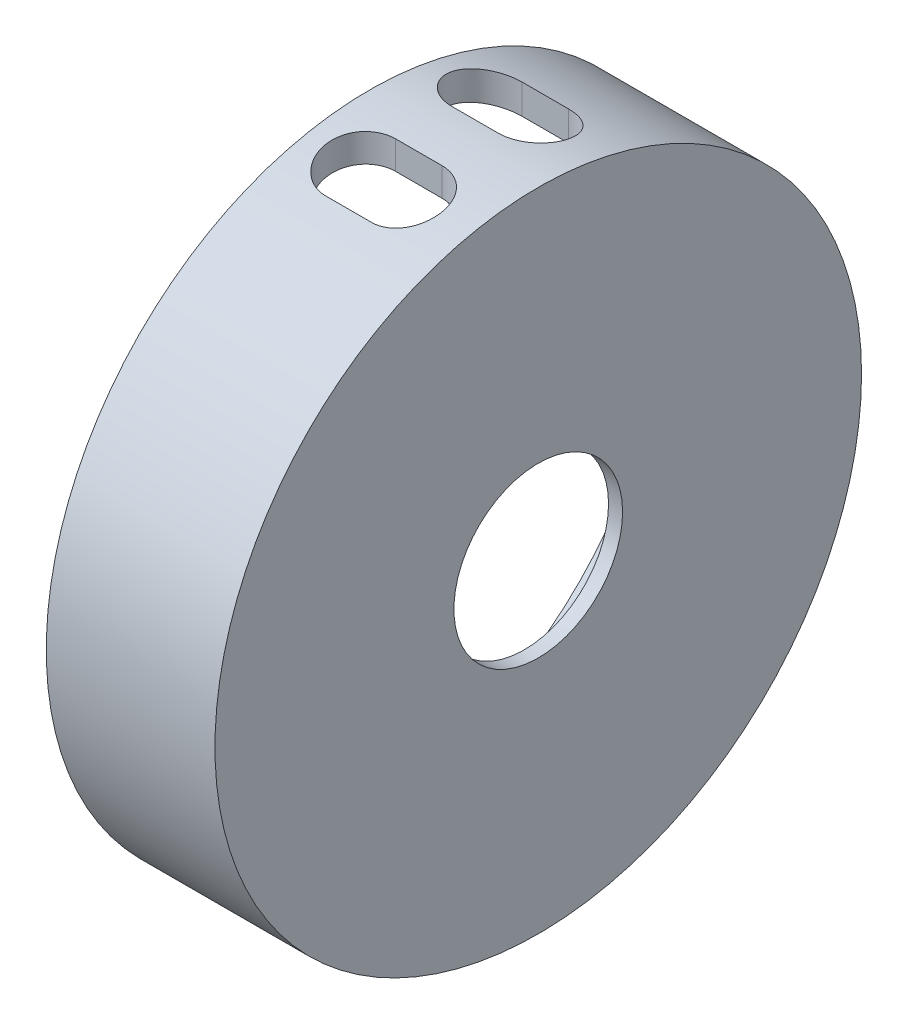
ISO-10303-21;
HEADER;
FILE_DESCRIPTION(('STEP AP214'),'2;1');
FILE_NAME('part.step','',(''),(''),'','','');
FILE_SCHEMA(('AUTOMOTIVE_DESIGN { 1 0 10303 214 1 1 1 1 }'));
ENDSEC;
DATA;
#1=APPLICATION_CONTEXT('core data for automotive mechanical design processes');
#2=APPLICATION_PROTOCOL_DEFINITION('international standard','automotive_design',2000,#1);
#3=PRODUCT_CONTEXT('',#1,'mechanical');
#4=PRODUCT('Part','Part','',(#3));
#5=PRODUCT_RELATED_PRODUCT_CATEGORY('part','',(#4));
#6=PRODUCT_DEFINITION_FORMATION('','',#4);
#7=PRODUCT_DEFINITION_CONTEXT('part definition',#1,'design');
#8=PRODUCT_DEFINITION('design','',#6,#7);
#9=PRODUCT_DEFINITION_SHAPE('','',#8);
#10=(LENGTH_UNIT() NAMED_UNIT(*) SI_UNIT(.MILLI.,.METRE.));
#11=(NAMED_UNIT(*) PLANE_ANGLE_UNIT() SI_UNIT($,.RADIAN.));
#12=(NAMED_UNIT(*) SI_UNIT($,.STERADIAN.) SOLID_ANGLE_UNIT());
#13=UNCERTAINTY_MEASURE_WITH_UNIT(LENGTH_MEASURE(1.E-05),#10,'distance_accuracy_value','');
#14=(GEOMETRIC_REPRESENTATION_CONTEXT(3) GLOBAL_UNCERTAINTY_ASSIGNED_CONTEXT((#13)) GLOBAL_UNIT_ASSIGNED_CONTEXT((#10,
#11,#12)) REPRESENTATION_CONTEXT('',''));
#15=CARTESIAN_POINT('',(0.,0.,0.));
#16=DIRECTION('',(0.,0.,1.));
#17=DIRECTION('',(1.,0.,0.));
#18=AXIS2_PLACEMENT_3D('',#15,#16,#17);
#19=CARTESIAN_POINT('',(12.,0.,0.));
#20=DIRECTION('',(-1.,0.,0.));
#21=DIRECTION('',(0.,0.,1.));
#22=AXIS2_PLACEMENT_3D('',#19,#20,#21);
#23=CYLINDRICAL_SURFACE('',#22,21.);
#24=CARTESIAN_POINT('',(7.15,20.9045449603669,-2.));
#25=CARTESIAN_POINT('',(7.22021227047538,20.9045426913064,-2.00000122796222));
#26=CARTESIAN_POINT('',(7.29038085489079,20.9042510069695,-2.00307486239214));
#27=CARTESIAN_POINT('',(7.43017121643106,20.9030845233542,-2.01522027917594));
#28=CARTESIAN_POINT('',(7.49979315974062,20.9022099088341,-2.02429016102667));
#29=CARTESIAN_POINT('',(7.70720455335078,20.8987051859865,-2.06027511636815));
#30=CARTESIAN_POINT('',(7.84355255118449,20.8951941995455,-2.09596555316585));
#31=CARTESIAN_POINT('',(8.10822270286466,20.8856411869064,-2.18910089355342));
#32=CARTESIAN_POINT('',(8.2365533780406,20.8796019024159,-2.24652222552062));
#33=CARTESIAN_POINT('',(8.48192598056066,20.8646267124957,-2.38158509549755));
#34=CARTESIAN_POINT('',(8.59897621702843,20.855692960607,-2.45921159204727));
#35=CARTESIAN_POINT('',(8.7639750741713,20.839726857974,-2.58993053218514));
#36=CARTESIAN_POINT('',(8.81753625925611,20.8339292894598,-2.63624494562));
#37=CARTESIAN_POINT('',(8.92033542067504,20.8214112085745,-2.73335541180013));
#38=CARTESIAN_POINT('',(8.96957373069827,20.8146907675442,-2.78415111801985));
#39=CARTESIAN_POINT('',(9.06331224841329,20.8002810531418,-2.88983516679451));
#40=CARTESIAN_POINT('',(9.10781103449678,20.7925914905857,-2.94472472894426));
#41=CARTESIAN_POINT('',(9.1918954958655,20.7762353688714,-3.05799411598975));
#42=CARTESIAN_POINT('',(9.23148067206817,20.7675687106386,-3.11637429454165));
#43=CARTESIAN_POINT('',(9.33995981844007,20.7407400300271,-3.29169959086135));
#44=CARTESIAN_POINT('',(9.4020019828851,20.7212239671093,-3.41276170498135));
#45=CARTESIAN_POINT('',(9.50620369317589,20.6785336460831,-3.66255239164538));
#46=CARTESIAN_POINT('',(9.54836069927927,20.6553589211928,-3.79128194111461));
#47=CARTESIAN_POINT('',(9.59691202057761,20.6172374754006,-3.99181501825951));
#48=CARTESIAN_POINT('',(9.61081239198555,20.603506654933,-4.06210855893026));
#49=CARTESIAN_POINT('',(9.63249958772457,20.5751304089876,-4.20347366862683));
#50=CARTESIAN_POINT('',(9.64028692795072,20.560485060802,-4.27454517148494));
#51=CARTESIAN_POINT('',(9.64724253449908,20.5379052238474,-4.38129849978757));
#52=CARTESIAN_POINT('',(9.6487735150127,20.5302767597358,-4.41690676063194));
#53=CARTESIAN_POINT('',(9.6502244194628,20.5148276540308,-4.48811450060974));
#54=CARTESIAN_POINT('',(9.65014441715129,20.5070070212513,-4.52371398007057));
#55=CARTESIAN_POINT('',(9.6475802596661,20.4832808437769,-4.63039064036622));
#56=CARTESIAN_POINT('',(9.64277256636663,20.4671089584302,-4.70135578864877));
#57=CARTESIAN_POINT('',(9.61958297101692,20.4183791418986,-4.91017941075926));
#58=CARTESIAN_POINT('',(9.59260791689488,20.3849700008098,-5.04697044168433));
#59=CARTESIAN_POINT('',(9.51668199817833,20.3169935559341,-5.31402192021364));
#60=CARTESIAN_POINT('',(9.4677145020562,20.2824253939927,-5.44427734230821));
#61=CARTESIAN_POINT('',(9.34633294080805,20.2118195065521,-5.70095325877762));
#62=CARTESIAN_POINT('',(9.27293154971143,20.1757884639414,-5.82691129778255));
#63=CARTESIAN_POINT('',(9.10510529061933,20.1056566325899,-6.06447974463556));
#64=CARTESIAN_POINT('',(9.01069402916139,20.0715546124107,-6.17609936495591));
#65=CARTESIAN_POINT('',(8.80400582825571,20.0076273414253,-6.38014108334063));
#66=CARTESIAN_POINT('',(8.69194486628871,19.9777577605186,-6.47276755956841));
#67=CARTESIAN_POINT('',(8.45252424558646,19.9235314263197,-6.63780532082079));
#68=CARTESIAN_POINT('',(8.32515385937471,19.8991785735337,-6.71020231133324));
#69=CARTESIAN_POINT('',(8.0638781601761,19.8583914268227,-6.82994654514799));
#70=CARTESIAN_POINT('',(7.93041074789508,19.8416892873839,-6.87814792226523));
#71=CARTESIAN_POINT('',(7.72533238106218,19.8225064613745,-6.93315169590463));
#72=CARTESIAN_POINT('',(7.65620340125308,19.8170920893588,-6.94859910754532));
#73=CARTESIAN_POINT('',(7.51676858314176,19.8083164597545,-6.97357734977822));
#74=CARTESIAN_POINT('',(7.44646350484752,19.8049539251865,-6.98311186037766));
#75=CARTESIAN_POINT('',(7.33831295859856,19.801439535912,-6.99306826525512));
#76=CARTESIAN_POINT('',(7.30067776270716,19.8005215533748,-6.99566659345754));
#77=CARTESIAN_POINT('',(7.22536380016249,19.7992969693932,-6.99913147466311));
#78=CARTESIAN_POINT('',(7.18768514225142,19.7989896253679,-7.0000001310757));
#79=CARTESIAN_POINT('',(7.15,19.7989898732233,-7.));
#80=B_SPLINE_CURVE_WITH_KNOTS('',3,(#24,#25,#26,#27,#28,#29,#30,#31,#32,#33,#34,#35,#36,#37,#38,
#39,#40,#41,#42,#43,#44,#45,#46,#47,#48,#49,#50,#51,#52,#53,#54,#55,#56,#57,#58,#59,#60,#61,#62,
#63,#64,#65,#66,#67,#68,#69,#70,#71,#72,#73,#74,#75,#76,#77,#78,#79),.UNSPECIFIED.,.F.,.F.,(4,2,
2,2,2,2,2,2,2,2,2,2,2,2,2,2,2,2,2,2,2,2,2,2,2,2,2,4),(0.,0.210487846141967,0.420909010386728,
0.841712893386399,1.26206163030663,1.6820983348783,1.89500626433395,2.10789774463564,
2.32085290243095,2.53382967272482,2.94425700987647,3.35473675282892,3.57339324619602,
3.79203128457202,3.90134707106748,4.01065785301557,4.22924958644451,4.65732176679469,
5.08571821825449,5.53410180809868,5.98219585382649,6.4251807530192,6.86847788612383,
7.29477566797926,7.50766678501958,7.72042527187464,7.83359447713268,7.94662597597191),.UNSPECIFIED.);
#81=CARTESIAN_POINT('',(7.15,20.9045449603669,-2.));
#82=VERTEX_POINT('',#81);
#83=CARTESIAN_POINT('',(7.15,19.7989898732233,-7.));
#84=VERTEX_POINT('',#83);
#85=EDGE_CURVE('E262',#82,#84,#80,.T.);
#86=ORIENTED_EDGE('',*,*,#85,.T.);
#87=DIRECTION('',(-1.,0.,0.));
#88=VECTOR('',#87,1.);
#89=CARTESIAN_POINT('',(12.,19.7989898732233,-7.));
#90=LINE('',#89,#88);
#91=CARTESIAN_POINT('',(3.85,19.7989898732233,-7.));
#92=VERTEX_POINT('',#91);
#93=EDGE_CURVE('E267',#84,#92,#90,.T.);
#94=ORIENTED_EDGE('',*,*,#93,.T.);
#95=CARTESIAN_POINT('',(3.85,19.7989898732233,-7.));
#96=CARTESIAN_POINT('',(3.78214047565855,19.7989870328711,-7.00000170529082));
#97=CARTESIAN_POINT('',(3.71432479908817,19.8000062933489,-6.99712574690852));
#98=CARTESIAN_POINT('',(3.57925465617807,19.8040158000695,-6.98577216492585));
#99=CARTESIAN_POINT('',(3.51199992870563,19.8070050706234,-6.97729731428958));
#100=CARTESIAN_POINT('',(3.31199783380946,19.8188013426174,-6.9437526491557));
#101=CARTESIAN_POINT('',(3.18069147168994,19.8304374906481,-6.91056124866765));
#102=CARTESIAN_POINT('',(2.92597989701261,19.860272737179,-6.8243403419459));
#103=CARTESIAN_POINT('',(2.80256032831641,19.8784594864682,-6.7713481572204));
#104=CARTESIAN_POINT('',(2.56615187324871,19.9203229117032,-6.64718080911228));
#105=CARTESIAN_POINT('',(2.45316391727838,19.944000076682,-6.57600402596425));
#106=CARTESIAN_POINT('',(2.29128021536958,19.9833411572921,-6.45507438395982));
#107=CARTESIAN_POINT('',(2.23747334556887,19.9974559024028,-6.41124686004126));
#108=CARTESIAN_POINT('',(2.13395108805763,20.0267058570919,-6.31928633593751));
#109=CARTESIAN_POINT('',(2.08423551577239,20.0418410205791,-6.27115353018539));
#110=CARTESIAN_POINT('',(1.98925123792332,20.0729320332687,-6.17091152494372));
#111=CARTESIAN_POINT('',(1.94398360141627,20.088888078372,-6.11880137482489));
#112=CARTESIAN_POINT('',(1.85804910720295,20.1213778706893,-6.01110020385699));
#113=CARTESIAN_POINT('',(1.81738272338226,20.1379116771781,-5.95550882538851));
#114=CARTESIAN_POINT('',(1.70196549891276,20.1883036424732,-5.78331325176012));
#115=CARTESIAN_POINT('',(1.63441917750148,20.2227443911079,-5.66195081633704));
#116=CARTESIAN_POINT('',(1.51976253901894,20.2916288919584,-5.40988541223444));
#117=CARTESIAN_POINT('',(1.47266005756407,20.3260726402739,-5.27917888451167));
#118=CARTESIAN_POINT('',(1.41720880231956,20.3778957271072,-5.07413171853143));
#119=CARTESIAN_POINT('',(1.40103264522759,20.3957379342721,-5.00194953744232));
#120=CARTESIAN_POINT('',(1.37512314055757,20.4309076680292,-4.85629619214898));
#121=CARTESIAN_POINT('',(1.36538958317891,20.4482352113637,-4.78282506999857));
#122=CARTESIAN_POINT('',(1.35263941960021,20.4822064550656,-4.6351866623409));
#123=CARTESIAN_POINT('',(1.34961904087906,20.4988505343462,-4.56101979136054));
#124=CARTESIAN_POINT('',(1.35046876450944,20.5313222831867,-4.41254798090227));
#125=CARTESIAN_POINT('',(1.35433871277357,20.5471499709952,-4.33824304454902));
#126=CARTESIAN_POINT('',(1.36845414032245,20.5771448671151,-4.19360242181085));
#127=CARTESIAN_POINT('',(1.37838940193202,20.5913552049029,-4.12324523016888));
#128=CARTESIAN_POINT('',(1.40422413124444,20.6188519845908,-3.9834694804391));
#129=CARTESIAN_POINT('',(1.42012361971402,20.6321384232737,-3.91405092562037));
#130=CARTESIAN_POINT('',(1.4765934933131,20.6705418099981,-3.70785229363806));
#131=CARTESIAN_POINT('',(1.52593823420601,20.6942089282728,-3.57309967725121));
#132=CARTESIAN_POINT('',(1.64695785163578,20.7374300298891,-3.3130671323615));
#133=CARTESIAN_POINT('',(1.71866033274868,20.7569788782283,-3.18779915324835));
#134=CARTESIAN_POINT('',(1.84169650890908,20.7831932897331,-3.01039510418385));
#135=CARTESIAN_POINT('',(1.88528960608179,20.7914133651215,-2.95300943522962));
#136=CARTESIAN_POINT('',(1.97742953614456,20.8068472135393,-2.84222281491));
#137=CARTESIAN_POINT('',(2.02597597166261,20.8140610671812,-2.78882154449802));
#138=CARTESIAN_POINT('',(2.17522707730034,20.8338066399709,-2.63864957471962));
#139=CARTESIAN_POINT('',(2.28232054280616,20.8450170212074,-2.54792340438902));
#140=CARTESIAN_POINT('',(2.5103697551143,20.8642314739099,-2.3854922522048));
#141=CARTESIAN_POINT('',(2.63133821782961,20.8722325735054,-2.31380492142163));
#142=CARTESIAN_POINT('',(2.88305124951773,20.8854139830587,-2.19163113753236));
#143=CARTESIAN_POINT('',(3.01375316998462,20.8906058600345,-2.14105794634194));
#144=CARTESIAN_POINT('',(3.2816480201246,20.8985314347218,-2.062274548604));
#145=CARTESIAN_POINT('',(3.41882864741505,20.9012696086593,-2.03402363130397));
#146=CARTESIAN_POINT('',(3.60585821141722,20.9034264712895,-2.01166085121076));
#147=CARTESIAN_POINT('',(3.65461879728873,20.9038462204572,-2.00729166676714));
#148=CARTESIAN_POINT('',(3.75224577557783,20.9044050582509,-2.00146437606446));
#149=CARTESIAN_POINT('',(3.80111192036139,20.9045445435014,-2.00000215595313));
#150=CARTESIAN_POINT('',(3.85,20.9045449603669,-2.));
#151=B_SPLINE_CURVE_WITH_KNOTS('',3,(#95,#96,#97,#98,#99,#100,#101,#102,#103,#104,#105,#106,
#107,#108,#109,#110,#111,#112,#113,#114,#115,#116,#117,#118,#119,#120,#121,#122,#123,#124,#125,
#126,#127,#128,#129,#130,#131,#132,#133,#134,#135,#136,#137,#138,#139,#140,#141,#142,#143,#144,
#145,#146,#147,#148,#149,#150),.UNSPECIFIED.,.F.,.F.,(4,2,2,2,2,2,2,2,2,2,2,2,2,2,2,2,2,2,2,2,2,
2,2,2,2,2,2,4),(0.,0.203429308453589,0.406757939902441,0.812464943220929,1.21741107577254,
1.62239329086719,1.83463743201691,2.0468719927346,2.25915743967099,2.47146473014126,
2.89884586132989,3.32639065275778,3.55443042723125,3.78246277531712,4.0103669464797,
4.23826602111762,4.4553855756266,4.67250588612687,5.10665664150565,5.54134556944593,
5.75869536295974,5.9760277336941,6.39621994633178,6.81680037348916,7.23563561481905,
7.6537052213401,7.80051217606334,7.9471112254984),.UNSPECIFIED.);
#152=CARTESIAN_POINT('',(3.85,20.9045449603669,-2.));
#153=VERTEX_POINT('',#152);
#154=EDGE_CURVE('E255',#92,#153,#151,.T.);
#155=ORIENTED_EDGE('',*,*,#154,.T.);
#156=DIRECTION('',(-1.,0.,0.));
#157=VECTOR('',#156,1.);
#158=CARTESIAN_POINT('',(12.,20.9045449603669,-2.));
#159=LINE('',#158,#157);
#160=EDGE_CURVE('E131',#82,#153,#159,.T.);
#161=ORIENTED_EDGE('',*,*,#160,.F.);
#162=EDGE_LOOP('',(#86,#94,#155,#161));
#163=FACE_BOUND('',#162,.T.);
#164=CARTESIAN_POINT('',(0.,0.,0.));
#165=DIRECTION('',(1.,0.,0.));
#166=DIRECTION('',(0.,0.,-1.));
#167=AXIS2_PLACEMENT_3D('',#164,#165,#166);
#168=CIRCLE('',#167,21.);
#169=CARTESIAN_POINT('',(0.,0.,-21.));
#170=VERTEX_POINT('',#169);
#171=EDGE_CURVE('E123',#170,#170,#168,.T.);
#172=ORIENTED_EDGE('',*,*,#171,.F.);
#173=EDGE_LOOP('',(#172));
#174=FACE_BOUND('',#173,.T.);
#175=CARTESIAN_POINT('',(7.14999999999999,20.9045449603669,2.));
#176=CARTESIAN_POINT('',(7.22021227047538,20.9045426913064,2.00000122796221));
#177=CARTESIAN_POINT('',(7.29038085489079,20.9042510069695,2.00307486239214));
#178=CARTESIAN_POINT('',(7.43017121643105,20.9030845233543,2.01522027917593));
#179=CARTESIAN_POINT('',(7.49979315974062,20.9022099088341,2.02429016102667));
#180=CARTESIAN_POINT('',(7.70720455335077,20.8987051859865,2.06027511636814));
#181=CARTESIAN_POINT('',(7.84355255118449,20.8951941995455,2.09596555316585));
#182=CARTESIAN_POINT('',(8.10822270286465,20.8856411869063,2.18910089355342));
#183=CARTESIAN_POINT('',(8.23655337804059,20.8796019024159,2.24652222552061));
#184=CARTESIAN_POINT('',(8.48192598056065,20.8646267124957,2.38158509549755));
#185=CARTESIAN_POINT('',(8.59897621702842,20.8556929606071,2.45921159204727));
#186=CARTESIAN_POINT('',(8.7639750741713,20.839726857974,2.58993053218513));
#187=CARTESIAN_POINT('',(8.8175362592561,20.8339292894598,2.63624494562));
#188=CARTESIAN_POINT('',(8.92033542067503,20.8214112085745,2.73335541180012));
#189=CARTESIAN_POINT('',(8.96957373069826,20.8146907675442,2.78415111801984));
#190=CARTESIAN_POINT('',(9.06331224841328,20.8002810531418,2.8898351667945));
#191=CARTESIAN_POINT('',(9.10781103449677,20.7925914905857,2.94472472894425));
#192=CARTESIAN_POINT('',(9.19189549586549,20.7762353688715,3.05799411598974));
#193=CARTESIAN_POINT('',(9.23148067206817,20.7675687106386,3.11637429454164));
#194=CARTESIAN_POINT('',(9.33995981844006,20.7407400300272,3.29169959086135));
#195=CARTESIAN_POINT('',(9.40200198288509,20.7212239671093,3.41276170498134));
#196=CARTESIAN_POINT('',(9.50620369317589,20.6785336460831,3.66255239164537));
#197=CARTESIAN_POINT('',(9.54836069927927,20.6553589211928,3.7912819411146));
#198=CARTESIAN_POINT('',(9.59691202057761,20.6172374754006,3.9918150182595));
#199=CARTESIAN_POINT('',(9.61081239198555,20.603506654933,4.06210855893025));
#200=CARTESIAN_POINT('',(9.63249958772457,20.5751304089876,4.20347366862682));
#201=CARTESIAN_POINT('',(9.64028692795072,20.560485060802,4.27454517148493));
#202=CARTESIAN_POINT('',(9.64724253449908,20.5379052238474,4.38129849978756));
#203=CARTESIAN_POINT('',(9.6487735150127,20.5302767597358,4.41690676063194));
#204=CARTESIAN_POINT('',(9.6502244194628,20.5148276540308,4.48811450060974));
#205=CARTESIAN_POINT('',(9.65014441715129,20.5070070212513,4.52371398007056));
#206=CARTESIAN_POINT('',(9.6475802596661,20.4832808437769,4.63039064036621));
#207=CARTESIAN_POINT('',(9.64277256636663,20.4671089584302,4.70135578864876));
#208=CARTESIAN_POINT('',(9.61958297101691,20.4183791418986,4.91017941075926));
#209=CARTESIAN_POINT('',(9.59260791689488,20.3849700008098,5.04697044168433));
#210=CARTESIAN_POINT('',(9.51668199817833,20.3169935559341,5.31402192021364));
#211=CARTESIAN_POINT('',(9.46771450205619,20.2824253939927,5.44427734230821));
#212=CARTESIAN_POINT('',(9.34633294080805,20.211819506552,5.70095325877762));
#213=CARTESIAN_POINT('',(9.27293154971143,20.1757884639414,5.82691129778255));
#214=CARTESIAN_POINT('',(9.10510529061933,20.1056566325899,6.06447974463555));
#215=CARTESIAN_POINT('',(9.0106940291614,20.0715546124107,6.17609936495591));
#216=CARTESIAN_POINT('',(8.80400582825572,20.0076273414253,6.38014108334061));
#217=CARTESIAN_POINT('',(8.69194486628872,19.9777577605186,6.4727675595684));
#218=CARTESIAN_POINT('',(8.45252424558648,19.9235314263198,6.63780532082078));
#219=CARTESIAN_POINT('',(8.32515385937473,19.8991785735336,6.71020231133322));
#220=CARTESIAN_POINT('',(8.06387816017612,19.8583914268227,6.82994654514798));
#221=CARTESIAN_POINT('',(7.9304107478951,19.8416892873839,6.87814792226522));
#222=CARTESIAN_POINT('',(7.72533238106219,19.8225064613745,6.93315169590463));
#223=CARTESIAN_POINT('',(7.6562034012531,19.8170920893588,6.94859910754531));
#224=CARTESIAN_POINT('',(7.51676858314177,19.8083164597545,6.97357734977821));
#225=CARTESIAN_POINT('',(7.44646350484753,19.8049539251866,6.98311186037766));
#226=CARTESIAN_POINT('',(7.33831295859857,19.801439535912,6.99306826525512));
#227=CARTESIAN_POINT('',(7.30067776270717,19.8005215533749,6.99566659345754));
#228=CARTESIAN_POINT('',(7.22536380016249,19.7992969693932,6.9991314746631));
#229=CARTESIAN_POINT('',(7.18768514225141,19.7989896253679,7.00000013107569));
#230=CARTESIAN_POINT('',(7.14999999999999,19.7989898732233,7.));
#231=B_SPLINE_CURVE_WITH_KNOTS('',3,(#175,#176,#177,#178,#179,#180,#181,#182,#183,#184,#185,
#186,#187,#188,#189,#190,#191,#192,#193,#194,#195,#196,#197,#198,#199,#200,#201,#202,#203,#204,
#205,#206,#207,#208,#209,#210,#211,#212,#213,#214,#215,#216,#217,#218,#219,#220,#221,#222,#223,
#224,#225,#226,#227,#228,#229,#230),.UNSPECIFIED.,.F.,.F.,(4,2,2,2,2,2,2,2,2,2,2,2,2,2,2,2,2,2,
2,2,2,2,2,2,2,2,2,4),(0.,0.210487846141965,0.420909010386724,0.841712893386394,1.26206163030663,
1.68209833487829,1.89500626433395,2.10789774463563,2.32085290243095,2.53382967272481,
2.94425700987646,3.35473675282891,3.57339324619601,3.79203128457202,3.90134707106748,
4.01065785301556,4.22924958644451,4.65732176679469,5.0857182182545,5.53410180809867,
5.98219585382647,6.42518075301918,6.8684778861238,7.29477566797924,7.50766678501956,
7.72042527187464,7.83359447713268,7.94662597597191),.UNSPECIFIED.);
#232=CARTESIAN_POINT('',(7.14999999999999,20.9045449603669,2.));
#233=VERTEX_POINT('',#232);
#234=CARTESIAN_POINT('',(7.14999999999999,19.7989898732233,7.));
#235=VERTEX_POINT('',#234);
#236=EDGE_CURVE('E11',#233,#235,#231,.T.);
#237=ORIENTED_EDGE('',*,*,#236,.F.);
#238=DIRECTION('',(-1.,0.,0.));
#239=VECTOR('',#238,1.);
#240=CARTESIAN_POINT('',(12.,20.9045449603669,2.));
#241=LINE('',#240,#239);
#242=CARTESIAN_POINT('',(3.85,20.9045449603669,2.));
#243=VERTEX_POINT('',#242);
#244=EDGE_CURVE('E245',#233,#243,#241,.T.);
#245=ORIENTED_EDGE('',*,*,#244,.T.);
#246=CARTESIAN_POINT('',(3.85,19.7989898732233,7.));
#247=CARTESIAN_POINT('',(3.78214047565854,19.7989870328711,7.00000170529082));
#248=CARTESIAN_POINT('',(3.71432479908816,19.8000062933489,6.99712574690852));
#249=CARTESIAN_POINT('',(3.57925465617807,19.8040158000695,6.98577216492584));
#250=CARTESIAN_POINT('',(3.51199992870563,19.8070050706234,6.97729731428958));
#251=CARTESIAN_POINT('',(3.31199783380945,19.8188013426174,6.9437526491557));
#252=CARTESIAN_POINT('',(3.18069147168994,19.8304374906481,6.91056124866765));
#253=CARTESIAN_POINT('',(2.9259798970126,19.860272737179,6.82434034194589));
#254=CARTESIAN_POINT('',(2.8025603283164,19.8784594864682,6.7713481572204));
#255=CARTESIAN_POINT('',(2.5661518732487,19.9203229117032,6.64718080911228));
#256=CARTESIAN_POINT('',(2.45316391727837,19.944000076682,6.57600402596425));
#257=CARTESIAN_POINT('',(2.29128021536958,19.9833411572921,6.45507438395982));
#258=CARTESIAN_POINT('',(2.23747334556887,19.9974559024028,6.41124686004125));
#259=CARTESIAN_POINT('',(2.13395108805762,20.0267058570919,6.31928633593751));
#260=CARTESIAN_POINT('',(2.08423551577239,20.041841020579,6.27115353018538));
#261=CARTESIAN_POINT('',(1.98925123792332,20.0729320332687,6.17091152494371));
#262=CARTESIAN_POINT('',(1.94398360141627,20.088888078372,6.11880137482489));
#263=CARTESIAN_POINT('',(1.85804910720294,20.1213778706893,6.01110020385699));
#264=CARTESIAN_POINT('',(1.81738272338225,20.1379116771781,5.95550882538851));
#265=CARTESIAN_POINT('',(1.70196549891276,20.1883036424732,5.78331325176011));
#266=CARTESIAN_POINT('',(1.63441917750148,20.2227443911079,5.66195081633704));
#267=CARTESIAN_POINT('',(1.51976253901893,20.2916288919584,5.40988541223443));
#268=CARTESIAN_POINT('',(1.47266005756407,20.3260726402739,5.27917888451167));
#269=CARTESIAN_POINT('',(1.41720880231956,20.3778957271072,5.07413171853143));
#270=CARTESIAN_POINT('',(1.40103264522758,20.3957379342721,5.00194953744232));
#271=CARTESIAN_POINT('',(1.37512314055757,20.4309076680292,4.85629619214897));
#272=CARTESIAN_POINT('',(1.36538958317891,20.4482352113637,4.78282506999856));
#273=CARTESIAN_POINT('',(1.35263941960021,20.4822064550656,4.6351866623409));
#274=CARTESIAN_POINT('',(1.34961904087905,20.4988505343462,4.56101979136053));
#275=CARTESIAN_POINT('',(1.35046876450943,20.5313222831867,4.41254798090226));
#276=CARTESIAN_POINT('',(1.35433871277357,20.5471499709952,4.33824304454901));
#277=CARTESIAN_POINT('',(1.36845414032244,20.5771448671151,4.19360242181085));
#278=CARTESIAN_POINT('',(1.37838940193201,20.5913552049029,4.12324523016888));
#279=CARTESIAN_POINT('',(1.40422413124444,20.6188519845908,3.98346948043909));
#280=CARTESIAN_POINT('',(1.42012361971402,20.6321384232737,3.91405092562037));
#281=CARTESIAN_POINT('',(1.47659349331309,20.6705418099981,3.70785229363806));
#282=CARTESIAN_POINT('',(1.52593823420601,20.6942089282728,3.57309967725121));
#283=CARTESIAN_POINT('',(1.64695785163578,20.7374300298891,3.3130671323615));
#284=CARTESIAN_POINT('',(1.71866033274867,20.7569788782283,3.18779915324835));
#285=CARTESIAN_POINT('',(1.84169650890908,20.7831932897331,3.01039510418384));
#286=CARTESIAN_POINT('',(1.88528960608178,20.7914133651215,2.95300943522962));
#287=CARTESIAN_POINT('',(1.97742953614456,20.8068472135393,2.84222281491));
#288=CARTESIAN_POINT('',(2.0259759716626,20.8140610671812,2.78882154449802));
#289=CARTESIAN_POINT('',(2.17522707730033,20.8338066399709,2.63864957471962));
#290=CARTESIAN_POINT('',(2.28232054280615,20.8450170212074,2.54792340438901));
#291=CARTESIAN_POINT('',(2.51036975511429,20.8642314739099,2.3854922522048));
#292=CARTESIAN_POINT('',(2.6313382178296,20.8722325735054,2.31380492142163));
#293=CARTESIAN_POINT('',(2.88305124951772,20.8854139830587,2.19163113753236));
#294=CARTESIAN_POINT('',(3.01375316998462,20.8906058600345,2.14105794634194));
#295=CARTESIAN_POINT('',(3.28164802012459,20.8985314347218,2.062274548604));
#296=CARTESIAN_POINT('',(3.41882864741505,20.9012696086593,2.03402363130396));
#297=CARTESIAN_POINT('',(3.60585821141721,20.9034264712895,2.01166085121076));
#298=CARTESIAN_POINT('',(3.65461879728872,20.9038462204572,2.00729166676714));
#299=CARTESIAN_POINT('',(3.75224577557783,20.9044050582509,2.00146437606445));
#300=CARTESIAN_POINT('',(3.80111192036138,20.9045445435014,2.00000215595312));
#301=CARTESIAN_POINT('',(3.85,20.9045449603669,2.));
#302=B_SPLINE_CURVE_WITH_KNOTS('',3,(#246,#247,#248,#249,#250,#251,#252,#253,#254,#255,#256,
#257,#258,#259,#260,#261,#262,#263,#264,#265,#266,#267,#268,#269,#270,#271,#272,#273,#274,#275,
#276,#277,#278,#279,#280,#281,#282,#283,#284,#285,#286,#287,#288,#289,#290,#291,#292,#293,#294,
#295,#296,#297,#298,#299,#300,#301),.UNSPECIFIED.,.F.,.F.,(4,2,2,2,2,2,2,2,2,2,2,2,2,2,2,2,2,2,
2,2,2,2,2,2,2,2,2,4),(0.,0.203429308453589,0.406757939902441,0.812464943220931,1.21741107577254,
1.6223932908672,1.83463743201691,2.04687199273461,2.25915743967099,2.47146473014126,
2.89884586132989,3.32639065275778,3.55443042723125,3.78246277531712,4.0103669464797,
4.23826602111762,4.4553855756266,4.67250588612687,5.10665664150565,5.54134556944592,
5.75869536295973,5.9760277336941,6.39621994633178,6.81680037348915,7.23563561481905,
7.6537052213401,7.80051217606334,7.9471112254984),.UNSPECIFIED.);
#303=CARTESIAN_POINT('',(3.85,19.7989898732233,7.));
#304=VERTEX_POINT('',#303);
#305=EDGE_CURVE('E237',#304,#243,#302,.T.);
#306=ORIENTED_EDGE('',*,*,#305,.F.);
#307=DIRECTION('',(-1.,0.,0.));
#308=VECTOR('',#307,1.);
#309=CARTESIAN_POINT('',(12.,19.7989898732233,7.));
#310=LINE('',#309,#308);
#311=EDGE_CURVE('E50',#235,#304,#310,.T.);
#312=ORIENTED_EDGE('',*,*,#311,.F.);
#313=EDGE_LOOP('',(#237,#245,#306,#312));
#314=FACE_BOUND('',#313,.T.);
#315=CARTESIAN_POINT('',(11.,0.,0.));
#316=DIRECTION('',(1.,0.,0.));
#317=DIRECTION('',(0.,0.,-1.));
#318=AXIS2_PLACEMENT_3D('',#315,#316,#317);
#319=CIRCLE('',#318,21.);
#320=CARTESIAN_POINT('',(11.,0.,-21.));
#321=VERTEX_POINT('',#320);
#322=EDGE_CURVE('E308',#321,#321,#319,.T.);
#323=ORIENTED_EDGE('',*,*,#322,.T.);
#324=EDGE_LOOP('',(#323));
#325=FACE_BOUND('',#324,.T.);
#326=ADVANCED_FACE('F35',(#163,#174,#314,#325),#23,.F.);
#327=CARTESIAN_POINT('',(12.,0.,0.));
#328=DIRECTION('',(-1.,0.,0.));
#329=DIRECTION('',(0.,0.,1.));
#330=AXIS2_PLACEMENT_3D('',#327,#328,#329);
#331=CYLINDRICAL_SURFACE('',#330,23.);
#332=DIRECTION('',(-1.,0.,0.));
#333=VECTOR('',#332,1.);
#334=CARTESIAN_POINT('',(12.,22.9128784747792,2.));
#335=LINE('',#334,#333);
#336=CARTESIAN_POINT('',(7.14999999999999,22.9128784747792,2.));
#337=VERTEX_POINT('',#336);
#338=CARTESIAN_POINT('',(3.85,22.9128784747792,2.));
#339=VERTEX_POINT('',#338);
#340=EDGE_CURVE('E287',#337,#339,#335,.T.);
#341=ORIENTED_EDGE('',*,*,#340,.F.);
#342=CARTESIAN_POINT('',(7.14999999999999,21.9089023002067,7.));
#343=CARTESIAN_POINT('',(7.81817940564996,21.9089023002067,7.));
#344=CARTESIAN_POINT('',(8.46080969429279,21.9995275773584,6.72703851142851));
#345=CARTESIAN_POINT('',(9.38360030604603,22.2620065551344,5.7995969601645));
#346=CARTESIAN_POINT('',(9.64530595549221,22.4222364473854,5.16518431923384));
#347=CARTESIAN_POINT('',(9.65456613937339,22.6815879602008,3.87057927935779));
#348=CARTESIAN_POINT('',(9.39217372553098,22.7792144380044,3.21395829647147));
#349=CARTESIAN_POINT('',(8.4707088270148,22.8917569663467,2.27806965164943));
#350=CARTESIAN_POINT('',(7.81784585396946,22.9128784747792,2.));
#351=CARTESIAN_POINT('',(7.14999999999999,22.9128784747792,2.));
#352=B_SPLINE_CURVE_WITH_KNOTS('',3,(#342,#343,#344,#345,#346,#347,#348,#349,#350,#351),
.UNSPECIFIED.,.F.,.F.,(4,2,2,2,4),(0.,0.25,0.5,0.75,1.),.UNSPECIFIED.);
#353=CARTESIAN_POINT('',(7.14999999999999,21.9089023002066,7.));
#354=VERTEX_POINT('',#353);
#355=EDGE_CURVE('E187',#337,#354,#352,.F.);
#356=ORIENTED_EDGE('',*,*,#355,.T.);
#357=DIRECTION('',(-1.,0.,0.));
#358=VECTOR('',#357,1.);
#359=CARTESIAN_POINT('',(12.,21.9089023002066,7.));
#360=LINE('',#359,#358);
#361=CARTESIAN_POINT('',(3.85,21.9089023002066,7.));
#362=VERTEX_POINT('',#361);
#363=EDGE_CURVE('E79',#354,#362,#360,.T.);
#364=ORIENTED_EDGE('',*,*,#363,.T.);
#365=CARTESIAN_POINT('',(3.85,21.9089023002066,7.));
#366=CARTESIAN_POINT('',(3.7816812510958,21.9088998468681,7.00000131928901));
#367=CARTESIAN_POINT('',(3.71340634905125,21.9098333044403,6.99708673079433));
#368=CARTESIAN_POINT('',(3.57741597600932,21.9135060121869,6.98557864918328));
#369=CARTESIAN_POINT('',(3.50970025952905,21.9162444220644,6.97698779865044));
#370=CARTESIAN_POINT('',(3.30826681915079,21.9270553319242,6.94297034223107));
#371=CARTESIAN_POINT('',(3.17599169806702,21.9377240295256,6.9092976074939));
#372=CARTESIAN_POINT('',(2.91937060026248,21.9651008866289,6.82176078092525));
#373=CARTESIAN_POINT('',(2.79501111605945,21.9817984146304,6.76793222658309));
#374=CARTESIAN_POINT('',(2.55686736764419,22.0202620937936,6.64171620335449));
#375=CARTESIAN_POINT('',(2.44308258277555,22.0420279952234,6.56932964885095));
#376=CARTESIAN_POINT('',(2.280487702508,22.078147999078,6.44649533797298));
#377=CARTESIAN_POINT('',(2.22664935150561,22.0910621105778,6.40213412146777));
#378=CARTESIAN_POINT('',(2.12311665661502,22.1178268588705,6.30904741657383));
#379=CARTESIAN_POINT('',(2.07342213495633,22.131677455442,6.26032211559075));
#380=CARTESIAN_POINT('',(1.97852719655582,22.1601270697241,6.15885869081425));
#381=CARTESIAN_POINT('',(1.93332798259877,22.1747262861637,6.10611949967389));
#382=CARTESIAN_POINT('',(1.84759060330482,22.2044497920916,5.99713339440472));
#383=CARTESIAN_POINT('',(1.80705289738148,22.2195741331424,5.94088613538043));
#384=CARTESIAN_POINT('',(1.69271347218821,22.2654291724296,5.76757187905657));
#385=CARTESIAN_POINT('',(1.62607735205455,22.2966749767039,5.64581563841657));
#386=CARTESIAN_POINT('',(1.51327979799478,22.3591406418174,5.39312142259202));
#387=CARTESIAN_POINT('',(1.46712458042675,22.3903604919131,5.26218067367427));
#388=CARTESIAN_POINT('',(1.41323154703591,22.4372438014331,5.05721729190739));
#389=CARTESIAN_POINT('',(1.39762714280677,22.4533393717765,4.9852860139237));
#390=CARTESIAN_POINT('',(1.37281526263207,22.4850591230478,4.84020841238824));
#391=CARTESIAN_POINT('',(1.36360752413937,22.5006833232976,4.76706213883139));
#392=CARTESIAN_POINT('',(1.35185761349563,22.5313092204357,4.62014444994859));
#393=CARTESIAN_POINT('',(1.34931200017252,22.5463112347576,4.54637337711266));
#394=CARTESIAN_POINT('',(1.35102503598852,22.5755738745157,4.39876408329261));
#395=CARTESIAN_POINT('',(1.35528361807561,22.5898345072564,4.32492586297736));
#396=CARTESIAN_POINT('',(1.37007030180156,22.6168708597872,4.18117794705111));
#397=CARTESIAN_POINT('',(1.38029933955747,22.6296847521485,4.11124449705139));
#398=CARTESIAN_POINT('',(1.40664150606287,22.654476889684,3.97236264310401));
#399=CARTESIAN_POINT('',(1.42275461096226,22.6664551382453,3.90341423516481));
#400=CARTESIAN_POINT('',(1.47973647203001,22.7010758480981,3.69868029927312));
#401=CARTESIAN_POINT('',(1.52925076225354,22.7224095921897,3.56497762697466));
#402=CARTESIAN_POINT('',(1.65058299648787,22.7614878459171,3.30634502446348));
#403=CARTESIAN_POINT('',(1.72255321855261,22.7792064411356,3.18148235546459));
#404=CARTESIAN_POINT('',(1.8458754272599,22.802961278543,3.00474932669539));
#405=CARTESIAN_POINT('',(1.88954527072019,22.8104092006145,2.94759717190225));
#406=CARTESIAN_POINT('',(1.98179912334588,22.8243917731075,2.8372917719069));
#407=CARTESIAN_POINT('',(2.03038275746069,22.8309264931398,2.78413822204589));
#408=CARTESIAN_POINT('',(2.17990182155441,22.8488397688005,2.63446626311759));
#409=CARTESIAN_POINT('',(2.28720238560591,22.8590132960694,2.54403093949572));
#410=CARTESIAN_POINT('',(2.51557557590232,22.8764441037279,2.38221880033881));
#411=CARTESIAN_POINT('',(2.63666096339576,22.8836986532529,2.31085985264949));
#412=CARTESIAN_POINT('',(2.88873867799874,22.8956529686733,2.18924737652029));
#413=CARTESIAN_POINT('',(3.01970589627335,22.9003589766348,2.13894235069825));
#414=CARTESIAN_POINT('',(3.28807448197709,22.907527400239,2.0607654468683));
#415=CARTESIAN_POINT('',(3.42546346441114,22.9099939612261,2.03285213172894));
#416=CARTESIAN_POINT('',(3.6115468755908,22.9119051421169,2.01112346377784));
#417=CARTESIAN_POINT('',(3.65917595107601,22.9122704076519,2.00695545880958));
#418=CARTESIAN_POINT('',(3.75452979564997,22.91275673378,2.00139675630795));
#419=CARTESIAN_POINT('',(3.802254335903,22.9128781371468,2.0000021604863));
#420=CARTESIAN_POINT('',(3.85,22.9128784747792,2.));
#421=B_SPLINE_CURVE_WITH_KNOTS('',3,(#365,#366,#367,#368,#369,#370,#371,#372,#373,#374,#375,
#376,#377,#378,#379,#380,#381,#382,#383,#384,#385,#386,#387,#388,#389,#390,#391,#392,#393,#394,
#395,#396,#397,#398,#399,#400,#401,#402,#403,#404,#405,#406,#407,#408,#409,#410,#411,#412,#413,
#414,#415,#416,#417,#418,#419,#420),.UNSPECIFIED.,.F.,.F.,(4,2,2,2,2,2,2,2,2,2,2,2,2,2,2,2,2,2,
2,2,2,2,2,2,2,2,2,4),(0.,0.204806913978309,0.409518547225998,0.818139393301451,1.22604315114247,
1.63392681476198,1.84654798767936,2.05916003443915,2.27182881644957,2.48451854003933,
2.90941620663306,3.33444274998793,3.56023447885172,3.78601693968834,4.01168275459617,
4.23734634569182,4.45257336042128,4.66779950277301,5.09816563813842,5.53151603547905,
5.74820215963013,5.9648717574333,6.38474856410066,6.80501728036828,7.22425193539257,
7.6427089715077,7.7860855404873,7.92926043732559),.UNSPECIFIED.);
#422=EDGE_CURVE('E40',#362,#339,#421,.T.);
#423=ORIENTED_EDGE('',*,*,#422,.T.);
#424=EDGE_LOOP('',(#341,#356,#364,#423));
#425=FACE_BOUND('',#424,.T.);
#426=CARTESIAN_POINT('',(0.,0.,0.));
#427=DIRECTION('',(1.,0.,0.));
#428=DIRECTION('',(0.,0.,-1.));
#429=AXIS2_PLACEMENT_3D('',#426,#427,#428);
#430=CIRCLE('',#429,23.);
#431=CARTESIAN_POINT('',(0.,0.,-23.));
#432=VERTEX_POINT('',#431);
#433=EDGE_CURVE('E334',#432,#432,#430,.T.);
#434=ORIENTED_EDGE('',*,*,#433,.T.);
#435=EDGE_LOOP('',(#434));
#436=FACE_BOUND('',#435,.T.);
#437=CARTESIAN_POINT('',(12.,0.,0.));
#438=DIRECTION('',(1.,0.,0.));
#439=DIRECTION('',(0.,0.,-1.));
#440=AXIS2_PLACEMENT_3D('',#437,#438,#439);
#441=CIRCLE('',#440,23.);
#442=CARTESIAN_POINT('',(12.,0.,-23.));
#443=VERTEX_POINT('',#442);
#444=EDGE_CURVE('E332',#443,#443,#441,.T.);
#445=ORIENTED_EDGE('',*,*,#444,.F.);
#446=EDGE_LOOP('',(#445));
#447=FACE_BOUND('',#446,.T.);
#448=CARTESIAN_POINT('',(7.15,22.9128784747792,-2.));
#449=CARTESIAN_POINT('',(7.81784585396946,22.9128784747792,-2.));
#450=CARTESIAN_POINT('',(8.4707088270148,22.8917569663467,-2.27806965164944));
#451=CARTESIAN_POINT('',(9.39217372553098,22.7792144380045,-3.21395829647147));
#452=CARTESIAN_POINT('',(9.65456613937339,22.6815879602008,-3.8705792793578));
#453=CARTESIAN_POINT('',(9.64530595549221,22.4222364473854,-5.16518431923385));
#454=CARTESIAN_POINT('',(9.38360030604603,22.2620065551344,-5.7995969601645));
#455=CARTESIAN_POINT('',(8.46080969429279,21.9995275773584,-6.72703851142852));
#456=CARTESIAN_POINT('',(7.81817940564996,21.9089023002067,-7.));
#457=CARTESIAN_POINT('',(7.15,21.9089023002067,-7.));
#458=B_SPLINE_CURVE_WITH_KNOTS('',3,(#448,#449,#450,#451,#452,#453,#454,#455,#456,#457),
.UNSPECIFIED.,.F.,.F.,(4,2,2,2,4),(0.,0.25,0.5,0.75,1.),.UNSPECIFIED.);
#459=CARTESIAN_POINT('',(7.15,22.9128784747792,-2.));
#460=VERTEX_POINT('',#459);
#461=CARTESIAN_POINT('',(7.15,21.9089023002067,-7.));
#462=VERTEX_POINT('',#461);
#463=EDGE_CURVE('E134',#460,#462,#458,.T.);
#464=ORIENTED_EDGE('',*,*,#463,.F.);
#465=DIRECTION('',(-1.,0.,0.));
#466=VECTOR('',#465,1.);
#467=CARTESIAN_POINT('',(12.,22.9128784747792,-2.));
#468=LINE('',#467,#466);
#469=CARTESIAN_POINT('',(3.85,22.9128784747792,-2.));
#470=VERTEX_POINT('',#469);
#471=EDGE_CURVE('E128',#460,#470,#468,.T.);
#472=ORIENTED_EDGE('',*,*,#471,.T.);
#473=CARTESIAN_POINT('',(3.85,21.9089023002066,-7.));
#474=CARTESIAN_POINT('',(3.78168125109581,21.9088998468681,-7.00000131928902));
#475=CARTESIAN_POINT('',(3.71340634905125,21.9098333044403,-6.99708673079434));
#476=CARTESIAN_POINT('',(3.57741597600933,21.9135060121869,-6.98557864918329));
#477=CARTESIAN_POINT('',(3.50970025952906,21.9162444220644,-6.97698779865044));
#478=CARTESIAN_POINT('',(3.30826681915079,21.9270553319242,-6.94297034223107));
#479=CARTESIAN_POINT('',(3.17599169806702,21.9377240295256,-6.90929760749391));
#480=CARTESIAN_POINT('',(2.91937060026249,21.9651008866289,-6.82176078092525));
#481=CARTESIAN_POINT('',(2.79501111605945,21.9817984146304,-6.76793222658309));
#482=CARTESIAN_POINT('',(2.55686736764419,22.0202620937936,-6.64171620335449));
#483=CARTESIAN_POINT('',(2.44308258277555,22.0420279952234,-6.56932964885096));
#484=CARTESIAN_POINT('',(2.280487702508,22.078147999078,-6.44649533797298));
#485=CARTESIAN_POINT('',(2.22664935150561,22.0910621105778,-6.40213412146778));
#486=CARTESIAN_POINT('',(2.12311665661502,22.1178268588705,-6.30904741657383));
#487=CARTESIAN_POINT('',(2.07342213495633,22.131677455442,-6.26032211559075));
#488=CARTESIAN_POINT('',(1.97852719655582,22.1601270697241,-6.15885869081426));
#489=CARTESIAN_POINT('',(1.93332798259878,22.1747262861637,-6.10611949967389));
#490=CARTESIAN_POINT('',(1.84759060330482,22.2044497920916,-5.99713339440472));
#491=CARTESIAN_POINT('',(1.80705289738149,22.2195741331424,-5.94088613538043));
#492=CARTESIAN_POINT('',(1.69271347218821,22.2654291724296,-5.76757187905658));
#493=CARTESIAN_POINT('',(1.62607735205455,22.2966749767039,-5.64581563841657));
#494=CARTESIAN_POINT('',(1.51327979799478,22.3591406418174,-5.39312142259202));
#495=CARTESIAN_POINT('',(1.46712458042675,22.3903604919131,-5.26218067367427));
#496=CARTESIAN_POINT('',(1.41323154703592,22.4372438014331,-5.0572172919074));
#497=CARTESIAN_POINT('',(1.39762714280678,22.4533393717765,-4.98528601392371));
#498=CARTESIAN_POINT('',(1.37281526263207,22.4850591230478,-4.84020841238824));
#499=CARTESIAN_POINT('',(1.36360752413938,22.5006833232976,-4.76706213883139));
#500=CARTESIAN_POINT('',(1.35185761349563,22.5313092204357,-4.62014444994859));
#501=CARTESIAN_POINT('',(1.34931200017253,22.5463112347576,-4.54637337711266));
#502=CARTESIAN_POINT('',(1.35102503598852,22.5755738745157,-4.39876408329261));
#503=CARTESIAN_POINT('',(1.35528361807561,22.5898345072564,-4.32492586297736));
#504=CARTESIAN_POINT('',(1.37007030180156,22.6168708597872,-4.18117794705111));
#505=CARTESIAN_POINT('',(1.38029933955747,22.6296847521485,-4.11124449705139));
#506=CARTESIAN_POINT('',(1.40664150606287,22.654476889684,-3.97236264310401));
#507=CARTESIAN_POINT('',(1.42275461096226,22.6664551382453,-3.90341423516482));
#508=CARTESIAN_POINT('',(1.47973647203002,22.701075848098,-3.69868029927313));
#509=CARTESIAN_POINT('',(1.52925076225355,22.7224095921897,-3.56497762697466));
#510=CARTESIAN_POINT('',(1.65058299648787,22.7614878459171,-3.30634502446348));
#511=CARTESIAN_POINT('',(1.72255321855261,22.7792064411356,-3.18148235546459));
#512=CARTESIAN_POINT('',(1.84587542725991,22.802961278543,-3.00474932669539));
#513=CARTESIAN_POINT('',(1.8895452707202,22.8104092006145,-2.94759717190226));
#514=CARTESIAN_POINT('',(1.98179912334588,22.8243917731075,-2.83729177190691));
#515=CARTESIAN_POINT('',(2.03038275746069,22.8309264931398,-2.78413822204589));
#516=CARTESIAN_POINT('',(2.17990182155442,22.8488397688005,-2.6344662631176));
#517=CARTESIAN_POINT('',(2.28720238560592,22.8590132960694,-2.54403093949572));
#518=CARTESIAN_POINT('',(2.51557557590233,22.8764441037279,-2.38221880033881));
#519=CARTESIAN_POINT('',(2.63666096339577,22.8836986532528,-2.31085985264949));
#520=CARTESIAN_POINT('',(2.88873867799875,22.8956529686732,-2.18924737652029));
#521=CARTESIAN_POINT('',(3.01970589627337,22.9003589766348,-2.13894235069825));
#522=CARTESIAN_POINT('',(3.2880744819771,22.907527400239,-2.0607654468683));
#523=CARTESIAN_POINT('',(3.42546346441115,22.9099939612261,-2.03285213172894));
#524=CARTESIAN_POINT('',(3.6115468755908,22.9119051421169,-2.01112346377784));
#525=CARTESIAN_POINT('',(3.65917595107601,22.9122704076519,-2.00695545880958));
#526=CARTESIAN_POINT('',(3.75452979564997,22.91275673378,-2.00139675630795));
#527=CARTESIAN_POINT('',(3.802254335903,22.9128781371468,-2.0000021604863));
#528=CARTESIAN_POINT('',(3.85,22.9128784747792,-2.));
#529=B_SPLINE_CURVE_WITH_KNOTS('',3,(#473,#474,#475,#476,#477,#478,#479,#480,#481,#482,#483,
#484,#485,#486,#487,#488,#489,#490,#491,#492,#493,#494,#495,#496,#497,#498,#499,#500,#501,#502,
#503,#504,#505,#506,#507,#508,#509,#510,#511,#512,#513,#514,#515,#516,#517,#518,#519,#520,#521,
#522,#523,#524,#525,#526,#527,#528),.UNSPECIFIED.,.F.,.F.,(4,2,2,2,2,2,2,2,2,2,2,2,2,2,2,2,2,2,
2,2,2,2,2,2,2,2,2,4),(0.,0.204806913978309,0.409518547225999,0.818139393301453,1.22604315114248,
1.63392681476199,1.84654798767936,2.05916003443915,2.27182881644957,2.48451854003933,
2.90941620663306,3.33444274998793,3.56023447885172,3.78601693968834,4.01168275459616,
4.23734634569182,4.45257336042128,4.66779950277301,5.09816563813842,5.53151603547905,
5.74820215963013,5.9648717574333,6.38474856410066,6.80501728036829,7.22425193539258,
7.64270897150771,7.7860855404873,7.92926043732559),.UNSPECIFIED.);
#530=CARTESIAN_POINT('',(3.85,21.9089023002066,-7.));
#531=VERTEX_POINT('',#530);
#532=EDGE_CURVE('E112',#531,#470,#529,.T.);
#533=ORIENTED_EDGE('',*,*,#532,.F.);
#534=DIRECTION('',(-1.,0.,0.));
#535=VECTOR('',#534,1.);
#536=CARTESIAN_POINT('',(12.,21.9089023002066,-7.));
#537=LINE('',#536,#535);
#538=EDGE_CURVE('E183',#462,#531,#537,.T.);
#539=ORIENTED_EDGE('',*,*,#538,.F.);
#540=EDGE_LOOP('',(#464,#472,#533,#539));
#541=FACE_BOUND('',#540,.T.);
#542=ADVANCED_FACE('F37',(#425,#436,#447,#541),#331,.T.);
#543=CARTESIAN_POINT('',(12.,0.,0.));
#544=DIRECTION('',(1.,0.,0.));
#545=DIRECTION('',(0.,0.,-1.));
#546=AXIS2_PLACEMENT_3D('',#543,#544,#545);
#547=PLANE('',#546);
#548=ORIENTED_EDGE('',*,*,#444,.T.);
#549=EDGE_LOOP('',(#548));
#550=FACE_BOUND('',#549,.T.);
#551=CARTESIAN_POINT('',(12.,0.,0.));
#552=DIRECTION('',(1.,0.,0.));
#553=DIRECTION('',(0.,0.,-1.));
#554=AXIS2_PLACEMENT_3D('',#551,#552,#553);
#555=CIRCLE('',#554,6.);
#556=CARTESIAN_POINT('',(12.,0.,-6.));
#557=VERTEX_POINT('',#556);
#558=EDGE_CURVE('E314',#557,#557,#555,.T.);
#559=ORIENTED_EDGE('',*,*,#558,.F.);
#560=EDGE_LOOP('',(#559));
#561=FACE_BOUND('',#560,.T.);
#562=ADVANCED_FACE('F251',(#550,#561),#547,.T.);
#563=CARTESIAN_POINT('',(0.,0.,0.));
#564=DIRECTION('',(1.,0.,0.));
#565=DIRECTION('',(0.,0.,-1.));
#566=AXIS2_PLACEMENT_3D('',#563,#564,#565);
#567=PLANE('',#566);
#568=ORIENTED_EDGE('',*,*,#433,.F.);
#569=EDGE_LOOP('',(#568));
#570=FACE_BOUND('',#569,.T.);
#571=ORIENTED_EDGE('',*,*,#171,.T.);
#572=EDGE_LOOP('',(#571));
#573=FACE_BOUND('',#572,.T.);
#574=ADVANCED_FACE('F323',(#570,#573),#567,.F.);
#575=CARTESIAN_POINT('',(12.,21.9089023002066,-7.));
#576=DIRECTION('',(0.,0.,1.));
#577=DIRECTION('',(1.,0.,0.));
#578=AXIS2_PLACEMENT_3D('',#575,#576,#577);
#579=PLANE('',#578);
#580=DIRECTION('',(0.,-1.,0.));
#581=VECTOR('',#580,1.);
#582=CARTESIAN_POINT('',(7.15,21.9089023002067,-7.));
#583=LINE('',#582,#581);
#584=EDGE_CURVE('E154',#462,#84,#583,.T.);
#585=ORIENTED_EDGE('',*,*,#584,.F.);
#586=ORIENTED_EDGE('',*,*,#538,.T.);
#587=DIRECTION('',(0.,-1.,0.));
#588=VECTOR('',#587,1.);
#589=CARTESIAN_POINT('',(3.85,21.9089023002066,-7.));
#590=LINE('',#589,#588);
#591=EDGE_CURVE('E118',#531,#92,#590,.T.);
#592=ORIENTED_EDGE('',*,*,#591,.T.);
#593=ORIENTED_EDGE('',*,*,#93,.F.);
#594=EDGE_LOOP('',(#585,#586,#592,#593));
#595=FACE_BOUND('',#594,.T.);
#596=ADVANCED_FACE('F167',(#595),#579,.T.);
#597=CARTESIAN_POINT('',(7.15,22.9128784747792,-2.));
#598=CARTESIAN_POINT('',(7.81784585396946,22.9128784747792,-2.));
#599=CARTESIAN_POINT('',(8.4707088270148,22.8917569663467,-2.27806965164944));
#600=CARTESIAN_POINT('',(9.39217372553098,22.7792144380045,-3.21395829647147));
#601=CARTESIAN_POINT('',(9.65456613937339,22.6815879602008,-3.8705792793578));
#602=CARTESIAN_POINT('',(9.64530595549221,22.4222364473854,-5.16518431923385));
#603=CARTESIAN_POINT('',(9.38360030604603,22.2620065551344,-5.7995969601645));
#604=CARTESIAN_POINT('',(8.46080969429279,21.9995275773584,-6.72703851142852));
#605=CARTESIAN_POINT('',(7.81817940564996,21.9089023002067,-7.));
#606=CARTESIAN_POINT('',(7.15,21.9089023002067,-7.));
#607=B_SPLINE_CURVE_WITH_KNOTS('',3,(#597,#598,#599,#600,#601,#602,#603,#604,#605,#606),
.UNSPECIFIED.,.F.,.F.,(4,2,2,2,4),(0.,0.25,0.5,0.75,1.),.UNSPECIFIED.);
#608=DIRECTION('',(0.,-1.,0.));
#609=VECTOR('',#608,1.);
#610=SURFACE_OF_LINEAR_EXTRUSION('',#607,#609);
#611=DIRECTION('',(0.,-1.,0.));
#612=VECTOR('',#611,1.);
#613=CARTESIAN_POINT('',(7.15,22.9128784747792,-2.));
#614=LINE('',#613,#612);
#615=EDGE_CURVE('E137',#460,#82,#614,.T.);
#616=ORIENTED_EDGE('',*,*,#615,.F.);
#617=ORIENTED_EDGE('',*,*,#463,.T.);
#618=ORIENTED_EDGE('',*,*,#584,.T.);
#619=ORIENTED_EDGE('',*,*,#85,.F.);
#620=EDGE_LOOP('',(#616,#617,#618,#619));
#621=FACE_BOUND('',#620,.T.);
#622=ADVANCED_FACE('F156',(#621),#610,.T.);
#623=CARTESIAN_POINT('',(3.85,21.9089023002066,-7.));
#624=CARTESIAN_POINT('',(3.18197708293607,21.9089023002066,-7.));
#625=CARTESIAN_POINT('',(2.53395196594859,22.0010592300138,-6.72160004029208));
#626=CARTESIAN_POINT('',(1.62230666204819,22.2602847480774,-5.80570730219351));
#627=CARTESIAN_POINT('',(1.35526044474231,22.4218775817559,-5.16665574527447));
#628=CARTESIAN_POINT('',(1.34489999306783,22.6810870329056,-3.87339862229385));
#629=CARTESIAN_POINT('',(1.60110423114324,22.7782914464223,-3.22142362520156));
#630=CARTESIAN_POINT('',(2.53365568796471,22.892391765283,-2.2730003642688));
#631=CARTESIAN_POINT('',(3.18222977924968,22.9128784747792,-2.));
#632=CARTESIAN_POINT('',(3.85,22.9128784747792,-2.));
#633=B_SPLINE_CURVE_WITH_KNOTS('',3,(#623,#624,#625,#626,#627,#628,#629,#630,#631,#632),
.UNSPECIFIED.,.F.,.F.,(4,2,2,2,4),(0.,0.25,0.5,0.75,1.),.UNSPECIFIED.);
#634=DIRECTION('',(0.,-1.,0.));
#635=VECTOR('',#634,1.);
#636=SURFACE_OF_LINEAR_EXTRUSION('',#633,#635);
#637=ORIENTED_EDGE('',*,*,#591,.F.);
#638=ORIENTED_EDGE('',*,*,#532,.T.);
#639=DIRECTION('',(0.,-1.,0.));
#640=VECTOR('',#639,1.);
#641=CARTESIAN_POINT('',(3.85,22.9128784747792,-2.));
#642=LINE('',#641,#640);
#643=EDGE_CURVE('E115',#470,#153,#642,.T.);
#644=ORIENTED_EDGE('',*,*,#643,.T.);
#645=ORIENTED_EDGE('',*,*,#154,.F.);
#646=EDGE_LOOP('',(#637,#638,#644,#645));
#647=FACE_BOUND('',#646,.T.);
#648=ADVANCED_FACE('F114',(#647),#636,.T.);
#649=CARTESIAN_POINT('',(12.,22.9128784747792,-2.));
#650=DIRECTION('',(0.,0.,1.));
#651=DIRECTION('',(1.,0.,0.));
#652=AXIS2_PLACEMENT_3D('',#649,#650,#651);
#653=PLANE('',#652);
#654=ORIENTED_EDGE('',*,*,#160,.T.);
#655=ORIENTED_EDGE('',*,*,#643,.F.);
#656=ORIENTED_EDGE('',*,*,#471,.F.);
#657=ORIENTED_EDGE('',*,*,#615,.T.);
#658=EDGE_LOOP('',(#654,#655,#656,#657));
#659=FACE_BOUND('',#658,.T.);
#660=ADVANCED_FACE('F127',(#659),#653,.F.);
#661=CARTESIAN_POINT('',(7.14999999999999,22.9128784747792,2.));
#662=CARTESIAN_POINT('',(7.81784585396946,22.9128784747792,2.));
#663=CARTESIAN_POINT('',(8.4707088270148,22.8917569663467,2.27806965164943));
#664=CARTESIAN_POINT('',(9.39217372553098,22.7792144380044,3.21395829647147));
#665=CARTESIAN_POINT('',(9.65456613937339,22.6815879602008,3.87057927935779));
#666=CARTESIAN_POINT('',(9.64530595549221,22.4222364473854,5.16518431923384));
#667=CARTESIAN_POINT('',(9.38360030604603,22.2620065551344,5.7995969601645));
#668=CARTESIAN_POINT('',(8.46080969429279,21.9995275773584,6.72703851142851));
#669=CARTESIAN_POINT('',(7.81817940564996,21.9089023002067,7.));
#670=CARTESIAN_POINT('',(7.14999999999999,21.9089023002067,7.));
#671=B_SPLINE_CURVE_WITH_KNOTS('',3,(#661,#662,#663,#664,#665,#666,#667,#668,#669,#670),
.UNSPECIFIED.,.F.,.F.,(4,2,2,2,4),(0.,0.25,0.5,0.75,1.),.UNSPECIFIED.);
#672=DIRECTION('',(0.,-1.,0.));
#673=VECTOR('',#672,1.);
#674=SURFACE_OF_LINEAR_EXTRUSION('',#671,#673);
#675=ORIENTED_EDGE('',*,*,#236,.T.);
#676=DIRECTION('',(0.,-1.,0.));
#677=VECTOR('',#676,1.);
#678=CARTESIAN_POINT('',(7.14999999999999,21.9089023002066,7.));
#679=LINE('',#678,#677);
#680=EDGE_CURVE('E192',#354,#235,#679,.T.);
#681=ORIENTED_EDGE('',*,*,#680,.F.);
#682=ORIENTED_EDGE('',*,*,#355,.F.);
#683=DIRECTION('',(0.,-1.,0.));
#684=VECTOR('',#683,1.);
#685=CARTESIAN_POINT('',(7.14999999999999,22.9128784747792,2.));
#686=LINE('',#685,#684);
#687=EDGE_CURVE('E59',#337,#233,#686,.T.);
#688=ORIENTED_EDGE('',*,*,#687,.T.);
#689=EDGE_LOOP('',(#675,#681,#682,#688));
#690=FACE_BOUND('',#689,.T.);
#691=ADVANCED_FACE('F201',(#690),#674,.F.);
#692=CARTESIAN_POINT('',(12.,21.9089023002066,7.));
#693=DIRECTION('',(0.,0.,1.));
#694=DIRECTION('',(1.,0.,0.));
#695=AXIS2_PLACEMENT_3D('',#692,#693,#694);
#696=PLANE('',#695);
#697=ORIENTED_EDGE('',*,*,#311,.T.);
#698=DIRECTION('',(0.,-1.,0.));
#699=VECTOR('',#698,1.);
#700=CARTESIAN_POINT('',(3.85,21.9089023002066,7.));
#701=LINE('',#700,#699);
#702=EDGE_CURVE('E218',#362,#304,#701,.T.);
#703=ORIENTED_EDGE('',*,*,#702,.F.);
#704=ORIENTED_EDGE('',*,*,#363,.F.);
#705=ORIENTED_EDGE('',*,*,#680,.T.);
#706=EDGE_LOOP('',(#697,#703,#704,#705));
#707=FACE_BOUND('',#706,.T.);
#708=ADVANCED_FACE('F211',(#707),#696,.F.);
#709=CARTESIAN_POINT('',(3.85,21.9089023002066,7.));
#710=CARTESIAN_POINT('',(3.18197708293607,21.9089023002066,7.));
#711=CARTESIAN_POINT('',(2.53395196594859,22.0010592300138,6.72160004029208));
#712=CARTESIAN_POINT('',(1.62230666204819,22.2602847480774,5.80570730219351));
#713=CARTESIAN_POINT('',(1.35526044474231,22.4218775817559,5.16665574527447));
#714=CARTESIAN_POINT('',(1.34489999306783,22.6810870329056,3.87339862229385));
#715=CARTESIAN_POINT('',(1.60110423114324,22.7782914464223,3.22142362520156));
#716=CARTESIAN_POINT('',(2.5336556879647,22.892391765283,2.2730003642688));
#717=CARTESIAN_POINT('',(3.18222977924968,22.9128784747792,2.));
#718=CARTESIAN_POINT('',(3.85,22.9128784747792,2.));
#719=B_SPLINE_CURVE_WITH_KNOTS('',3,(#709,#710,#711,#712,#713,#714,#715,#716,#717,#718),
.UNSPECIFIED.,.F.,.F.,(4,2,2,2,4),(0.,0.25,0.5,0.75,1.),.UNSPECIFIED.);
#720=DIRECTION('',(0.,-1.,0.));
#721=VECTOR('',#720,1.);
#722=SURFACE_OF_LINEAR_EXTRUSION('',#719,#721);
#723=ORIENTED_EDGE('',*,*,#305,.T.);
#724=DIRECTION('',(0.,-1.,0.));
#725=VECTOR('',#724,1.);
#726=CARTESIAN_POINT('',(3.85,22.9128784747792,2.));
#727=LINE('',#726,#725);
#728=EDGE_CURVE('E285',#339,#243,#727,.T.);
#729=ORIENTED_EDGE('',*,*,#728,.F.);
#730=ORIENTED_EDGE('',*,*,#422,.F.);
#731=ORIENTED_EDGE('',*,*,#702,.T.);
#732=EDGE_LOOP('',(#723,#729,#730,#731));
#733=FACE_BOUND('',#732,.T.);
#734=ADVANCED_FACE('F229',(#733),#722,.F.);
#735=CARTESIAN_POINT('',(12.,22.9128784747792,2.));
#736=DIRECTION('',(0.,0.,1.));
#737=DIRECTION('',(1.,0.,0.));
#738=AXIS2_PLACEMENT_3D('',#735,#736,#737);
#739=PLANE('',#738);
#740=ORIENTED_EDGE('',*,*,#687,.F.);
#741=ORIENTED_EDGE('',*,*,#340,.T.);
#742=ORIENTED_EDGE('',*,*,#728,.T.);
#743=ORIENTED_EDGE('',*,*,#244,.F.);
#744=EDGE_LOOP('',(#740,#741,#742,#743));
#745=FACE_BOUND('',#744,.T.);
#746=ADVANCED_FACE('F233',(#745),#739,.T.);
#747=CARTESIAN_POINT('',(11.,0.,0.));
#748=DIRECTION('',(1.,0.,0.));
#749=DIRECTION('',(0.,0.,-1.));
#750=AXIS2_PLACEMENT_3D('',#747,#748,#749);
#751=PLANE('',#750);
#752=CARTESIAN_POINT('',(11.,0.,0.));
#753=DIRECTION('',(1.,0.,0.));
#754=DIRECTION('',(0.,0.,-1.));
#755=AXIS2_PLACEMENT_3D('',#752,#753,#754);
#756=CIRCLE('',#755,6.);
#757=CARTESIAN_POINT('',(11.,0.,-6.));
#758=VERTEX_POINT('',#757);
#759=EDGE_CURVE('E311',#758,#758,#756,.T.);
#760=ORIENTED_EDGE('',*,*,#759,.T.);
#761=EDGE_LOOP('',(#760));
#762=FACE_BOUND('',#761,.T.);
#763=ORIENTED_EDGE('',*,*,#322,.F.);
#764=EDGE_LOOP('',(#763));
#765=FACE_BOUND('',#764,.T.);
#766=ADVANCED_FACE('F212',(#762,#765),#751,.F.);
#767=CARTESIAN_POINT('',(11.,0.,0.));
#768=DIRECTION('',(1.,0.,0.));
#769=DIRECTION('',(0.,0.,-1.));
#770=AXIS2_PLACEMENT_3D('',#767,#768,#769);
#771=CYLINDRICAL_SURFACE('',#770,6.);
#772=ORIENTED_EDGE('',*,*,#759,.F.);
#773=EDGE_LOOP('',(#772));
#774=FACE_BOUND('',#773,.T.);
#775=ORIENTED_EDGE('',*,*,#558,.T.);
#776=EDGE_LOOP('',(#775));
#777=FACE_BOUND('',#776,.T.);
#778=ADVANCED_FACE('F320',(#774,#777),#771,.F.);
#779=CLOSED_SHELL('',(#326,#542,#562,#574,#596,#622,#648,#660,#691,#708,#734,#746,#766,#778));
#780=MANIFOLD_SOLID_BREP('B2',#779);
#781=ADVANCED_BREP_SHAPE_REPRESENTATION('',(#18,#780),#14);
#782=SHAPE_DEFINITION_REPRESENTATION(#9,#781);
ENDSEC;
END-ISO-10303-21;
